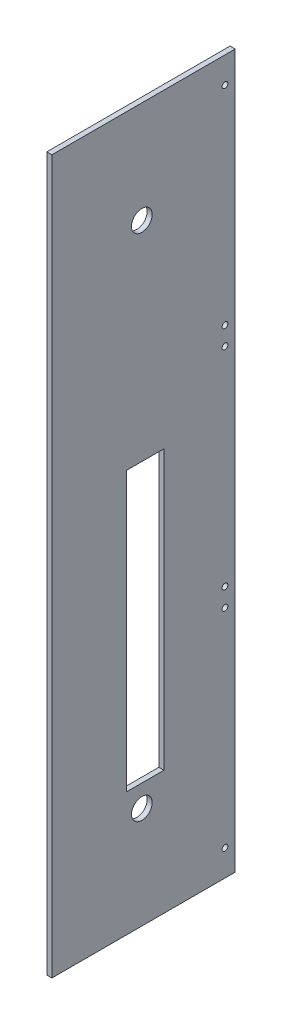
ISO-10303-21;
HEADER;
FILE_DESCRIPTION(('STEP AP214'),'2;1');
FILE_NAME('part.step','',(''),(''),'','','');
FILE_SCHEMA(('AUTOMOTIVE_DESIGN { 1 0 10303 214 1 1 1 1 }'));
ENDSEC;
DATA;
#1=APPLICATION_CONTEXT('core data for automotive mechanical design processes');
#2=APPLICATION_PROTOCOL_DEFINITION('international standard','automotive_design',2000,#1);
#3=PRODUCT_CONTEXT('',#1,'mechanical');
#4=PRODUCT('Part','Part','',(#3));
#5=PRODUCT_RELATED_PRODUCT_CATEGORY('part','',(#4));
#6=PRODUCT_DEFINITION_FORMATION('','',#4);
#7=PRODUCT_DEFINITION_CONTEXT('part definition',#1,'design');
#8=PRODUCT_DEFINITION('design','',#6,#7);
#9=PRODUCT_DEFINITION_SHAPE('','',#8);
#10=(LENGTH_UNIT() NAMED_UNIT(*) SI_UNIT(.MILLI.,.METRE.));
#11=(NAMED_UNIT(*) PLANE_ANGLE_UNIT() SI_UNIT($,.RADIAN.));
#12=(NAMED_UNIT(*) SI_UNIT($,.STERADIAN.) SOLID_ANGLE_UNIT());
#13=UNCERTAINTY_MEASURE_WITH_UNIT(LENGTH_MEASURE(1.E-05),#10,'distance_accuracy_value','');
#14=(GEOMETRIC_REPRESENTATION_CONTEXT(3) GLOBAL_UNCERTAINTY_ASSIGNED_CONTEXT((#13)) GLOBAL_UNIT_ASSIGNED_CONTEXT((#10,
#11,#12)) REPRESENTATION_CONTEXT('',''));
#15=CARTESIAN_POINT('',(0.,0.,0.));
#16=DIRECTION('',(0.,0.,1.));
#17=DIRECTION('',(1.,0.,0.));
#18=AXIS2_PLACEMENT_3D('',#15,#16,#17);
#19=CARTESIAN_POINT('',(0.,0.,108.));
#20=DIRECTION('',(0.,0.,1.));
#21=DIRECTION('',(1.,0.,0.));
#22=AXIS2_PLACEMENT_3D('',#19,#20,#21);
#23=PLANE('',#22);
#24=DIRECTION('',(-1.,0.,0.));
#25=VECTOR('',#24,1.);
#26=CARTESIAN_POINT('',(0.,-210.,108.));
#27=LINE('',#26,#25);
#28=CARTESIAN_POINT('',(1.5,-210.,108.));
#29=VERTEX_POINT('',#28);
#30=CARTESIAN_POINT('',(-1.5,-210.,108.));
#31=VERTEX_POINT('',#30);
#32=EDGE_CURVE('E183',#29,#31,#27,.T.);
#33=ORIENTED_EDGE('',*,*,#32,.F.);
#34=DIRECTION('',(0.,-1.,0.));
#35=VECTOR('',#34,1.);
#36=CARTESIAN_POINT('',(1.5,0.,108.));
#37=LINE('',#36,#35);
#38=CARTESIAN_POINT('',(1.5,210.,108.));
#39=VERTEX_POINT('',#38);
#40=EDGE_CURVE('E173',#39,#29,#37,.T.);
#41=ORIENTED_EDGE('',*,*,#40,.F.);
#42=DIRECTION('',(1.,0.,0.));
#43=VECTOR('',#42,1.);
#44=CARTESIAN_POINT('',(0.,210.,108.));
#45=LINE('',#44,#43);
#46=CARTESIAN_POINT('',(-1.5,210.,108.));
#47=VERTEX_POINT('',#46);
#48=EDGE_CURVE('E177',#47,#39,#45,.T.);
#49=ORIENTED_EDGE('',*,*,#48,.F.);
#50=DIRECTION('',(0.,1.,0.));
#51=VECTOR('',#50,1.);
#52=CARTESIAN_POINT('',(-1.5,0.,108.));
#53=LINE('',#52,#51);
#54=EDGE_CURVE('E180',#31,#47,#53,.T.);
#55=ORIENTED_EDGE('',*,*,#54,.F.);
#56=EDGE_LOOP('',(#33,#41,#49,#55));
#57=FACE_BOUND('',#56,.T.);
#58=ADVANCED_FACE('F17',(#57),#23,.T.);
#59=CARTESIAN_POINT('',(0.,-210.,0.));
#60=DIRECTION('',(0.,-1.,0.));
#61=DIRECTION('',(0.,0.,-1.));
#62=AXIS2_PLACEMENT_3D('',#59,#60,#61);
#63=PLANE('',#62);
#64=DIRECTION('',(0.,0.,1.));
#65=VECTOR('',#64,1.);
#66=CARTESIAN_POINT('',(1.5,-210.,0.));
#67=LINE('',#66,#65);
#68=CARTESIAN_POINT('',(1.5,-210.,0.));
#69=VERTEX_POINT('',#68);
#70=EDGE_CURVE('E152',#69,#29,#67,.T.);
#71=ORIENTED_EDGE('',*,*,#70,.T.);
#72=ORIENTED_EDGE('',*,*,#32,.T.);
#73=DIRECTION('',(0.,0.,1.));
#74=VECTOR('',#73,1.);
#75=CARTESIAN_POINT('',(-1.5,-210.,0.));
#76=LINE('',#75,#74);
#77=CARTESIAN_POINT('',(-1.5,-210.,0.));
#78=VERTEX_POINT('',#77);
#79=EDGE_CURVE('E170',#78,#31,#76,.T.);
#80=ORIENTED_EDGE('',*,*,#79,.F.);
#81=DIRECTION('',(1.,0.,0.));
#82=VECTOR('',#81,1.);
#83=CARTESIAN_POINT('',(0.,-210.,0.));
#84=LINE('',#83,#82);
#85=EDGE_CURVE('E143',#78,#69,#84,.T.);
#86=ORIENTED_EDGE('',*,*,#85,.T.);
#87=EDGE_LOOP('',(#71,#72,#80,#86));
#88=FACE_BOUND('',#87,.T.);
#89=ADVANCED_FACE('F255',(#88),#63,.T.);
#90=CARTESIAN_POINT('',(-1.5,0.,0.));
#91=DIRECTION('',(-1.,0.,0.));
#92=DIRECTION('',(0.,0.,1.));
#93=AXIS2_PLACEMENT_3D('',#90,#91,#92);
#94=PLANE('',#93);
#95=CARTESIAN_POINT('',(-1.5,150.,55.));
#96=DIRECTION('',(-1.,0.,0.));
#97=DIRECTION('',(0.,0.,1.));
#98=AXIS2_PLACEMENT_3D('',#95,#96,#97);
#99=CIRCLE('',#98,6.1);
#100=CARTESIAN_POINT('',(-1.5,150.,61.1));
#101=VERTEX_POINT('',#100);
#102=EDGE_CURVE('E214',#101,#101,#99,.T.);
#103=ORIENTED_EDGE('',*,*,#102,.F.);
#104=EDGE_LOOP('',(#103));
#105=FACE_BOUND('',#104,.T.);
#106=CARTESIAN_POINT('',(-1.5,-150.,55.));
#107=DIRECTION('',(-1.,0.,0.));
#108=DIRECTION('',(0.,0.,1.));
#109=AXIS2_PLACEMENT_3D('',#106,#107,#108);
#110=CIRCLE('',#109,6.1);
#111=CARTESIAN_POINT('',(-1.5,-150.,61.1));
#112=VERTEX_POINT('',#111);
#113=EDGE_CURVE('E97',#112,#112,#110,.T.);
#114=ORIENTED_EDGE('',*,*,#113,.F.);
#115=EDGE_LOOP('',(#114));
#116=FACE_BOUND('',#115,.T.);
#117=DIRECTION('',(0.,1.,0.));
#118=VECTOR('',#117,1.);
#119=CARTESIAN_POINT('',(-1.5,0.,64.));
#120=LINE('',#119,#118);
#121=CARTESIAN_POINT('',(-1.5,-137.,64.));
#122=VERTEX_POINT('',#121);
#123=CARTESIAN_POINT('',(-1.5,27.,64.));
#124=VERTEX_POINT('',#123);
#125=EDGE_CURVE('E102',#122,#124,#120,.T.);
#126=ORIENTED_EDGE('',*,*,#125,.F.);
#127=DIRECTION('',(0.,0.,1.));
#128=VECTOR('',#127,1.);
#129=CARTESIAN_POINT('',(-1.5,-137.,0.));
#130=LINE('',#129,#128);
#131=CARTESIAN_POINT('',(-1.5,-137.,42.));
#132=VERTEX_POINT('',#131);
#133=EDGE_CURVE('E92',#132,#122,#130,.T.);
#134=ORIENTED_EDGE('',*,*,#133,.F.);
#135=DIRECTION('',(0.,-1.,0.));
#136=VECTOR('',#135,1.);
#137=CARTESIAN_POINT('',(-1.5,0.,42.));
#138=LINE('',#137,#136);
#139=CARTESIAN_POINT('',(-1.5,27.,42.));
#140=VERTEX_POINT('',#139);
#141=EDGE_CURVE('E80',#140,#132,#138,.T.);
#142=ORIENTED_EDGE('',*,*,#141,.F.);
#143=DIRECTION('',(0.,0.,-1.));
#144=VECTOR('',#143,1.);
#145=CARTESIAN_POINT('',(-1.5,27.,0.));
#146=LINE('',#145,#144);
#147=EDGE_CURVE('E86',#124,#140,#146,.T.);
#148=ORIENTED_EDGE('',*,*,#147,.F.);
#149=EDGE_LOOP('',(#126,#134,#142,#148));
#150=FACE_BOUND('',#149,.T.);
#151=CARTESIAN_POINT('',(-1.5,194.6,6.));
#152=DIRECTION('',(-1.,0.,0.));
#153=DIRECTION('',(0.,0.,1.));
#154=AXIS2_PLACEMENT_3D('',#151,#152,#153);
#155=CIRCLE('',#154,1.7);
#156=CARTESIAN_POINT('',(-1.5,194.6,7.7));
#157=VERTEX_POINT('',#156);
#158=EDGE_CURVE('E114',#157,#157,#155,.T.);
#159=ORIENTED_EDGE('',*,*,#158,.F.);
#160=EDGE_LOOP('',(#159));
#161=FACE_BOUND('',#160,.T.);
#162=CARTESIAN_POINT('',(-1.5,72.1,6.));
#163=DIRECTION('',(-1.,0.,0.));
#164=DIRECTION('',(0.,0.,1.));
#165=AXIS2_PLACEMENT_3D('',#162,#163,#164);
#166=CIRCLE('',#165,1.7);
#167=CARTESIAN_POINT('',(-1.5,72.1,7.7));
#168=VERTEX_POINT('',#167);
#169=EDGE_CURVE('E119',#168,#168,#166,.T.);
#170=ORIENTED_EDGE('',*,*,#169,.F.);
#171=EDGE_LOOP('',(#170));
#172=FACE_BOUND('',#171,.T.);
#173=CARTESIAN_POINT('',(-1.5,61.25,6.));
#174=DIRECTION('',(-1.,0.,0.));
#175=DIRECTION('',(0.,0.,1.));
#176=AXIS2_PLACEMENT_3D('',#173,#174,#175);
#177=CIRCLE('',#176,1.7);
#178=CARTESIAN_POINT('',(-1.5,61.25,7.7));
#179=VERTEX_POINT('',#178);
#180=EDGE_CURVE('E124',#179,#179,#177,.T.);
#181=ORIENTED_EDGE('',*,*,#180,.F.);
#182=EDGE_LOOP('',(#181));
#183=FACE_BOUND('',#182,.T.);
#184=CARTESIAN_POINT('',(-1.5,-61.25,6.));
#185=DIRECTION('',(-1.,0.,0.));
#186=DIRECTION('',(0.,0.,1.));
#187=AXIS2_PLACEMENT_3D('',#184,#185,#186);
#188=CIRCLE('',#187,1.7);
#189=CARTESIAN_POINT('',(-1.5,-61.25,7.7));
#190=VERTEX_POINT('',#189);
#191=EDGE_CURVE('E129',#190,#190,#188,.T.);
#192=ORIENTED_EDGE('',*,*,#191,.F.);
#193=EDGE_LOOP('',(#192));
#194=FACE_BOUND('',#193,.T.);
#195=CARTESIAN_POINT('',(-1.5,-72.1,6.));
#196=DIRECTION('',(-1.,0.,0.));
#197=DIRECTION('',(0.,0.,1.));
#198=AXIS2_PLACEMENT_3D('',#195,#196,#197);
#199=CIRCLE('',#198,1.7);
#200=CARTESIAN_POINT('',(-1.5,-72.1,7.7));
#201=VERTEX_POINT('',#200);
#202=EDGE_CURVE('E134',#201,#201,#199,.T.);
#203=ORIENTED_EDGE('',*,*,#202,.F.);
#204=EDGE_LOOP('',(#203));
#205=FACE_BOUND('',#204,.T.);
#206=CARTESIAN_POINT('',(-1.5,-194.6,6.));
#207=DIRECTION('',(-1.,0.,0.));
#208=DIRECTION('',(0.,0.,1.));
#209=AXIS2_PLACEMENT_3D('',#206,#207,#208);
#210=CIRCLE('',#209,1.7);
#211=CARTESIAN_POINT('',(-1.5,-194.6,7.7));
#212=VERTEX_POINT('',#211);
#213=EDGE_CURVE('E139',#212,#212,#210,.T.);
#214=ORIENTED_EDGE('',*,*,#213,.F.);
#215=EDGE_LOOP('',(#214));
#216=FACE_BOUND('',#215,.T.);
#217=ORIENTED_EDGE('',*,*,#79,.T.);
#218=ORIENTED_EDGE('',*,*,#54,.T.);
#219=DIRECTION('',(0.,0.,1.));
#220=VECTOR('',#219,1.);
#221=CARTESIAN_POINT('',(-1.5,210.,0.));
#222=LINE('',#221,#220);
#223=CARTESIAN_POINT('',(-1.5,210.,0.));
#224=VERTEX_POINT('',#223);
#225=EDGE_CURVE('E166',#224,#47,#222,.T.);
#226=ORIENTED_EDGE('',*,*,#225,.F.);
#227=DIRECTION('',(0.,-1.,0.));
#228=VECTOR('',#227,1.);
#229=CARTESIAN_POINT('',(-1.5,0.,0.));
#230=LINE('',#229,#228);
#231=EDGE_CURVE('E147',#224,#78,#230,.T.);
#232=ORIENTED_EDGE('',*,*,#231,.T.);
#233=EDGE_LOOP('',(#217,#218,#226,#232));
#234=FACE_BOUND('',#233,.T.);
#235=ADVANCED_FACE('F100',(#105,#116,#150,#161,#172,#183,#194,#205,#216,#234),#94,.T.);
#236=CARTESIAN_POINT('',(0.,210.,0.));
#237=DIRECTION('',(0.,1.,0.));
#238=DIRECTION('',(0.,0.,1.));
#239=AXIS2_PLACEMENT_3D('',#236,#237,#238);
#240=PLANE('',#239);
#241=ORIENTED_EDGE('',*,*,#225,.T.);
#242=ORIENTED_EDGE('',*,*,#48,.T.);
#243=DIRECTION('',(0.,0.,1.));
#244=VECTOR('',#243,1.);
#245=CARTESIAN_POINT('',(1.5,210.,0.));
#246=LINE('',#245,#244);
#247=CARTESIAN_POINT('',(1.5,210.,0.));
#248=VERTEX_POINT('',#247);
#249=EDGE_CURVE('E162',#248,#39,#246,.T.);
#250=ORIENTED_EDGE('',*,*,#249,.F.);
#251=DIRECTION('',(-1.,0.,0.));
#252=VECTOR('',#251,1.);
#253=CARTESIAN_POINT('',(0.,210.,0.));
#254=LINE('',#253,#252);
#255=EDGE_CURVE('E153',#248,#224,#254,.T.);
#256=ORIENTED_EDGE('',*,*,#255,.T.);
#257=EDGE_LOOP('',(#241,#242,#250,#256));
#258=FACE_BOUND('',#257,.T.);
#259=ADVANCED_FACE('F271',(#258),#240,.T.);
#260=CARTESIAN_POINT('',(0.,0.,0.));
#261=DIRECTION('',(0.,0.,-1.));
#262=DIRECTION('',(-1.,0.,0.));
#263=AXIS2_PLACEMENT_3D('',#260,#261,#262);
#264=PLANE('',#263);
#265=DIRECTION('',(0.,1.,0.));
#266=VECTOR('',#265,1.);
#267=CARTESIAN_POINT('',(1.5,0.,0.));
#268=LINE('',#267,#266);
#269=EDGE_CURVE('E148',#69,#248,#268,.T.);
#270=ORIENTED_EDGE('',*,*,#269,.F.);
#271=ORIENTED_EDGE('',*,*,#85,.F.);
#272=ORIENTED_EDGE('',*,*,#231,.F.);
#273=ORIENTED_EDGE('',*,*,#255,.F.);
#274=EDGE_LOOP('',(#270,#271,#272,#273));
#275=FACE_BOUND('',#274,.T.);
#276=ADVANCED_FACE('F269',(#275),#264,.T.);
#277=CARTESIAN_POINT('',(1.5,0.,0.));
#278=DIRECTION('',(1.,0.,0.));
#279=DIRECTION('',(0.,0.,-1.));
#280=AXIS2_PLACEMENT_3D('',#277,#278,#279);
#281=PLANE('',#280);
#282=CARTESIAN_POINT('',(1.5,150.,55.));
#283=DIRECTION('',(1.,0.,0.));
#284=DIRECTION('',(0.,0.,-1.));
#285=AXIS2_PLACEMENT_3D('',#282,#283,#284);
#286=CIRCLE('',#285,6.1);
#287=CARTESIAN_POINT('',(1.5,150.,48.9));
#288=VERTEX_POINT('',#287);
#289=EDGE_CURVE('E20',#288,#288,#286,.T.);
#290=ORIENTED_EDGE('',*,*,#289,.F.);
#291=EDGE_LOOP('',(#290));
#292=FACE_BOUND('',#291,.T.);
#293=CARTESIAN_POINT('',(1.5,-150.,55.));
#294=DIRECTION('',(1.,0.,0.));
#295=DIRECTION('',(0.,0.,-1.));
#296=AXIS2_PLACEMENT_3D('',#293,#294,#295);
#297=CIRCLE('',#296,6.1);
#298=CARTESIAN_POINT('',(1.5,-150.,48.9));
#299=VERTEX_POINT('',#298);
#300=EDGE_CURVE('E211',#299,#299,#297,.T.);
#301=ORIENTED_EDGE('',*,*,#300,.F.);
#302=EDGE_LOOP('',(#301));
#303=FACE_BOUND('',#302,.T.);
#304=DIRECTION('',(0.,-1.,0.));
#305=VECTOR('',#304,1.);
#306=CARTESIAN_POINT('',(1.5,0.,64.));
#307=LINE('',#306,#305);
#308=CARTESIAN_POINT('',(1.5,27.,64.));
#309=VERTEX_POINT('',#308);
#310=CARTESIAN_POINT('',(1.5,-137.,64.));
#311=VERTEX_POINT('',#310);
#312=EDGE_CURVE('E11',#309,#311,#307,.T.);
#313=ORIENTED_EDGE('',*,*,#312,.F.);
#314=DIRECTION('',(0.,0.,1.));
#315=VECTOR('',#314,1.);
#316=CARTESIAN_POINT('',(1.5,27.,0.));
#317=LINE('',#316,#315);
#318=CARTESIAN_POINT('',(1.5,27.,42.));
#319=VERTEX_POINT('',#318);
#320=EDGE_CURVE('E207',#319,#309,#317,.T.);
#321=ORIENTED_EDGE('',*,*,#320,.F.);
#322=DIRECTION('',(0.,1.,0.));
#323=VECTOR('',#322,1.);
#324=CARTESIAN_POINT('',(1.5,0.,42.));
#325=LINE('',#324,#323);
#326=CARTESIAN_POINT('',(1.5,-137.,42.));
#327=VERTEX_POINT('',#326);
#328=EDGE_CURVE('E186',#327,#319,#325,.T.);
#329=ORIENTED_EDGE('',*,*,#328,.F.);
#330=DIRECTION('',(0.,0.,-1.));
#331=VECTOR('',#330,1.);
#332=CARTESIAN_POINT('',(1.5,-137.,0.));
#333=LINE('',#332,#331);
#334=EDGE_CURVE('E26',#311,#327,#333,.T.);
#335=ORIENTED_EDGE('',*,*,#334,.F.);
#336=EDGE_LOOP('',(#313,#321,#329,#335));
#337=FACE_BOUND('',#336,.T.);
#338=CARTESIAN_POINT('',(1.5,194.6,6.));
#339=DIRECTION('',(1.,0.,0.));
#340=DIRECTION('',(0.,0.,-1.));
#341=AXIS2_PLACEMENT_3D('',#338,#339,#340);
#342=CIRCLE('',#341,1.7);
#343=CARTESIAN_POINT('',(1.5,194.6,4.3));
#344=VERTEX_POINT('',#343);
#345=EDGE_CURVE('E109',#344,#344,#342,.T.);
#346=ORIENTED_EDGE('',*,*,#345,.F.);
#347=EDGE_LOOP('',(#346));
#348=FACE_BOUND('',#347,.T.);
#349=CARTESIAN_POINT('',(1.5,72.1,6.));
#350=DIRECTION('',(1.,0.,0.));
#351=DIRECTION('',(0.,0.,-1.));
#352=AXIS2_PLACEMENT_3D('',#349,#350,#351);
#353=CIRCLE('',#352,1.7);
#354=CARTESIAN_POINT('',(1.5,72.1,4.3));
#355=VERTEX_POINT('',#354);
#356=EDGE_CURVE('E118',#355,#355,#353,.T.);
#357=ORIENTED_EDGE('',*,*,#356,.F.);
#358=EDGE_LOOP('',(#357));
#359=FACE_BOUND('',#358,.T.);
#360=CARTESIAN_POINT('',(1.5,61.25,6.));
#361=DIRECTION('',(1.,0.,0.));
#362=DIRECTION('',(0.,0.,-1.));
#363=AXIS2_PLACEMENT_3D('',#360,#361,#362);
#364=CIRCLE('',#363,1.7);
#365=CARTESIAN_POINT('',(1.5,61.25,4.3));
#366=VERTEX_POINT('',#365);
#367=EDGE_CURVE('E123',#366,#366,#364,.T.);
#368=ORIENTED_EDGE('',*,*,#367,.F.);
#369=EDGE_LOOP('',(#368));
#370=FACE_BOUND('',#369,.T.);
#371=CARTESIAN_POINT('',(1.5,-61.25,6.));
#372=DIRECTION('',(1.,0.,0.));
#373=DIRECTION('',(0.,0.,-1.));
#374=AXIS2_PLACEMENT_3D('',#371,#372,#373);
#375=CIRCLE('',#374,1.7);
#376=CARTESIAN_POINT('',(1.5,-61.25,4.3));
#377=VERTEX_POINT('',#376);
#378=EDGE_CURVE('E128',#377,#377,#375,.T.);
#379=ORIENTED_EDGE('',*,*,#378,.F.);
#380=EDGE_LOOP('',(#379));
#381=FACE_BOUND('',#380,.T.);
#382=CARTESIAN_POINT('',(1.5,-72.1,6.));
#383=DIRECTION('',(1.,0.,0.));
#384=DIRECTION('',(0.,0.,-1.));
#385=AXIS2_PLACEMENT_3D('',#382,#383,#384);
#386=CIRCLE('',#385,1.7);
#387=CARTESIAN_POINT('',(1.5,-72.1,4.3));
#388=VERTEX_POINT('',#387);
#389=EDGE_CURVE('E133',#388,#388,#386,.T.);
#390=ORIENTED_EDGE('',*,*,#389,.F.);
#391=EDGE_LOOP('',(#390));
#392=FACE_BOUND('',#391,.T.);
#393=CARTESIAN_POINT('',(1.5,-194.6,6.));
#394=DIRECTION('',(1.,0.,0.));
#395=DIRECTION('',(0.,0.,-1.));
#396=AXIS2_PLACEMENT_3D('',#393,#394,#395);
#397=CIRCLE('',#396,1.7);
#398=CARTESIAN_POINT('',(1.5,-194.6,4.3));
#399=VERTEX_POINT('',#398);
#400=EDGE_CURVE('E138',#399,#399,#397,.T.);
#401=ORIENTED_EDGE('',*,*,#400,.F.);
#402=EDGE_LOOP('',(#401));
#403=FACE_BOUND('',#402,.T.);
#404=ORIENTED_EDGE('',*,*,#269,.T.);
#405=ORIENTED_EDGE('',*,*,#249,.T.);
#406=ORIENTED_EDGE('',*,*,#40,.T.);
#407=ORIENTED_EDGE('',*,*,#70,.F.);
#408=EDGE_LOOP('',(#404,#405,#406,#407));
#409=FACE_BOUND('',#408,.T.);
#410=ADVANCED_FACE('F240',(#292,#303,#337,#348,#359,#370,#381,#392,#403,#409),#281,.T.);
#411=CARTESIAN_POINT('',(-1.8,-194.6,6.));
#412=DIRECTION('',(1.,0.,0.));
#413=DIRECTION('',(0.,0.,-1.));
#414=AXIS2_PLACEMENT_3D('',#411,#412,#413);
#415=CYLINDRICAL_SURFACE('',#414,1.7);
#416=ORIENTED_EDGE('',*,*,#213,.T.);
#417=EDGE_LOOP('',(#416));
#418=FACE_BOUND('',#417,.T.);
#419=ORIENTED_EDGE('',*,*,#400,.T.);
#420=EDGE_LOOP('',(#419));
#421=FACE_BOUND('',#420,.T.);
#422=ADVANCED_FACE('F283',(#418,#421),#415,.F.);
#423=CARTESIAN_POINT('',(-1.8,-72.1,6.));
#424=DIRECTION('',(1.,0.,0.));
#425=DIRECTION('',(0.,0.,-1.));
#426=AXIS2_PLACEMENT_3D('',#423,#424,#425);
#427=CYLINDRICAL_SURFACE('',#426,1.7);
#428=ORIENTED_EDGE('',*,*,#202,.T.);
#429=EDGE_LOOP('',(#428));
#430=FACE_BOUND('',#429,.T.);
#431=ORIENTED_EDGE('',*,*,#389,.T.);
#432=EDGE_LOOP('',(#431));
#433=FACE_BOUND('',#432,.T.);
#434=ADVANCED_FACE('F289',(#430,#433),#427,.F.);
#435=CARTESIAN_POINT('',(-1.8,-61.25,6.));
#436=DIRECTION('',(1.,0.,0.));
#437=DIRECTION('',(0.,0.,-1.));
#438=AXIS2_PLACEMENT_3D('',#435,#436,#437);
#439=CYLINDRICAL_SURFACE('',#438,1.7);
#440=ORIENTED_EDGE('',*,*,#191,.T.);
#441=EDGE_LOOP('',(#440));
#442=FACE_BOUND('',#441,.T.);
#443=ORIENTED_EDGE('',*,*,#378,.T.);
#444=EDGE_LOOP('',(#443));
#445=FACE_BOUND('',#444,.T.);
#446=ADVANCED_FACE('F293',(#442,#445),#439,.F.);
#447=CARTESIAN_POINT('',(-1.8,61.25,6.));
#448=DIRECTION('',(1.,0.,0.));
#449=DIRECTION('',(0.,0.,-1.));
#450=AXIS2_PLACEMENT_3D('',#447,#448,#449);
#451=CYLINDRICAL_SURFACE('',#450,1.7);
#452=ORIENTED_EDGE('',*,*,#180,.T.);
#453=EDGE_LOOP('',(#452));
#454=FACE_BOUND('',#453,.T.);
#455=ORIENTED_EDGE('',*,*,#367,.T.);
#456=EDGE_LOOP('',(#455));
#457=FACE_BOUND('',#456,.T.);
#458=ADVANCED_FACE('F297',(#454,#457),#451,.F.);
#459=CARTESIAN_POINT('',(-1.8,72.1,6.));
#460=DIRECTION('',(1.,0.,0.));
#461=DIRECTION('',(0.,0.,-1.));
#462=AXIS2_PLACEMENT_3D('',#459,#460,#461);
#463=CYLINDRICAL_SURFACE('',#462,1.7);
#464=ORIENTED_EDGE('',*,*,#169,.T.);
#465=EDGE_LOOP('',(#464));
#466=FACE_BOUND('',#465,.T.);
#467=ORIENTED_EDGE('',*,*,#356,.T.);
#468=EDGE_LOOP('',(#467));
#469=FACE_BOUND('',#468,.T.);
#470=ADVANCED_FACE('F301',(#466,#469),#463,.F.);
#471=CARTESIAN_POINT('',(-1.8,194.6,6.));
#472=DIRECTION('',(1.,0.,0.));
#473=DIRECTION('',(0.,0.,-1.));
#474=AXIS2_PLACEMENT_3D('',#471,#472,#473);
#475=CYLINDRICAL_SURFACE('',#474,1.7);
#476=ORIENTED_EDGE('',*,*,#158,.T.);
#477=EDGE_LOOP('',(#476));
#478=FACE_BOUND('',#477,.T.);
#479=ORIENTED_EDGE('',*,*,#345,.T.);
#480=EDGE_LOOP('',(#479));
#481=FACE_BOUND('',#480,.T.);
#482=ADVANCED_FACE('F305',(#478,#481),#475,.F.);
#483=CARTESIAN_POINT('',(0.,-55.,64.));
#484=DIRECTION('',(0.,0.,1.));
#485=DIRECTION('',(1.,0.,0.));
#486=AXIS2_PLACEMENT_3D('',#483,#484,#485);
#487=PLANE('',#486);
#488=ORIENTED_EDGE('',*,*,#125,.T.);
#489=DIRECTION('',(1.,0.,0.));
#490=VECTOR('',#489,1.);
#491=CARTESIAN_POINT('',(0.,27.,64.));
#492=LINE('',#491,#490);
#493=EDGE_CURVE('E230',#124,#309,#492,.T.);
#494=ORIENTED_EDGE('',*,*,#493,.T.);
#495=ORIENTED_EDGE('',*,*,#312,.T.);
#496=DIRECTION('',(-1.,0.,0.));
#497=VECTOR('',#496,1.);
#498=CARTESIAN_POINT('',(0.,-137.,64.));
#499=LINE('',#498,#497);
#500=EDGE_CURVE('E87',#311,#122,#499,.T.);
#501=ORIENTED_EDGE('',*,*,#500,.T.);
#502=EDGE_LOOP('',(#488,#494,#495,#501));
#503=FACE_BOUND('',#502,.T.);
#504=ADVANCED_FACE('F236',(#503),#487,.F.);
#505=CARTESIAN_POINT('',(0.,-137.,42.));
#506=DIRECTION('',(0.,-1.,0.));
#507=DIRECTION('',(0.,0.,-1.));
#508=AXIS2_PLACEMENT_3D('',#505,#506,#507);
#509=PLANE('',#508);
#510=ORIENTED_EDGE('',*,*,#133,.T.);
#511=ORIENTED_EDGE('',*,*,#500,.F.);
#512=ORIENTED_EDGE('',*,*,#334,.T.);
#513=DIRECTION('',(1.,0.,0.));
#514=VECTOR('',#513,1.);
#515=CARTESIAN_POINT('',(0.,-137.,42.));
#516=LINE('',#515,#514);
#517=EDGE_CURVE('E39',#132,#327,#516,.T.);
#518=ORIENTED_EDGE('',*,*,#517,.F.);
#519=EDGE_LOOP('',(#510,#511,#512,#518));
#520=FACE_BOUND('',#519,.T.);
#521=ADVANCED_FACE('F90',(#520),#509,.F.);
#522=CARTESIAN_POINT('',(0.,27.,42.));
#523=DIRECTION('',(0.,1.,0.));
#524=DIRECTION('',(0.,0.,1.));
#525=AXIS2_PLACEMENT_3D('',#522,#523,#524);
#526=PLANE('',#525);
#527=ORIENTED_EDGE('',*,*,#147,.T.);
#528=DIRECTION('',(-1.,0.,0.));
#529=VECTOR('',#528,1.);
#530=CARTESIAN_POINT('',(0.,27.,42.));
#531=LINE('',#530,#529);
#532=EDGE_CURVE('E34',#319,#140,#531,.T.);
#533=ORIENTED_EDGE('',*,*,#532,.F.);
#534=ORIENTED_EDGE('',*,*,#320,.T.);
#535=ORIENTED_EDGE('',*,*,#493,.F.);
#536=EDGE_LOOP('',(#527,#533,#534,#535));
#537=FACE_BOUND('',#536,.T.);
#538=ADVANCED_FACE('F244',(#537),#526,.F.);
#539=CARTESIAN_POINT('',(0.,-55.,42.));
#540=DIRECTION('',(0.,0.,-1.));
#541=DIRECTION('',(-1.,0.,0.));
#542=AXIS2_PLACEMENT_3D('',#539,#540,#541);
#543=PLANE('',#542);
#544=ORIENTED_EDGE('',*,*,#141,.T.);
#545=ORIENTED_EDGE('',*,*,#517,.T.);
#546=ORIENTED_EDGE('',*,*,#328,.T.);
#547=ORIENTED_EDGE('',*,*,#532,.T.);
#548=EDGE_LOOP('',(#544,#545,#546,#547));
#549=FACE_BOUND('',#548,.T.);
#550=ADVANCED_FACE('F81',(#549),#543,.F.);
#551=CARTESIAN_POINT('',(-1.8,-150.,55.));
#552=DIRECTION('',(1.,0.,0.));
#553=DIRECTION('',(0.,0.,-1.));
#554=AXIS2_PLACEMENT_3D('',#551,#552,#553);
#555=CYLINDRICAL_SURFACE('',#554,6.1);
#556=ORIENTED_EDGE('',*,*,#113,.T.);
#557=EDGE_LOOP('',(#556));
#558=FACE_BOUND('',#557,.T.);
#559=ORIENTED_EDGE('',*,*,#300,.T.);
#560=EDGE_LOOP('',(#559));
#561=FACE_BOUND('',#560,.T.);
#562=ADVANCED_FACE('F251',(#558,#561),#555,.F.);
#563=CARTESIAN_POINT('',(-1.8,150.,55.));
#564=DIRECTION('',(1.,0.,0.));
#565=DIRECTION('',(0.,0.,-1.));
#566=AXIS2_PLACEMENT_3D('',#563,#564,#565);
#567=CYLINDRICAL_SURFACE('',#566,6.1);
#568=ORIENTED_EDGE('',*,*,#102,.T.);
#569=EDGE_LOOP('',(#568));
#570=FACE_BOUND('',#569,.T.);
#571=ORIENTED_EDGE('',*,*,#289,.T.);
#572=EDGE_LOOP('',(#571));
#573=FACE_BOUND('',#572,.T.);
#574=ADVANCED_FACE('F343',(#570,#573),#567,.F.);
#575=CLOSED_SHELL('',(#58,#89,#235,#259,#276,#410,#422,#434,#446,#458,#470,#482,#504,#521,#538,
#550,#562,#574));
#576=MANIFOLD_SOLID_BREP('B1',#575);
#577=ADVANCED_BREP_SHAPE_REPRESENTATION('',(#18,#576),#14);
#578=SHAPE_DEFINITION_REPRESENTATION(#9,#577);
ENDSEC;
END-ISO-10303-21;
